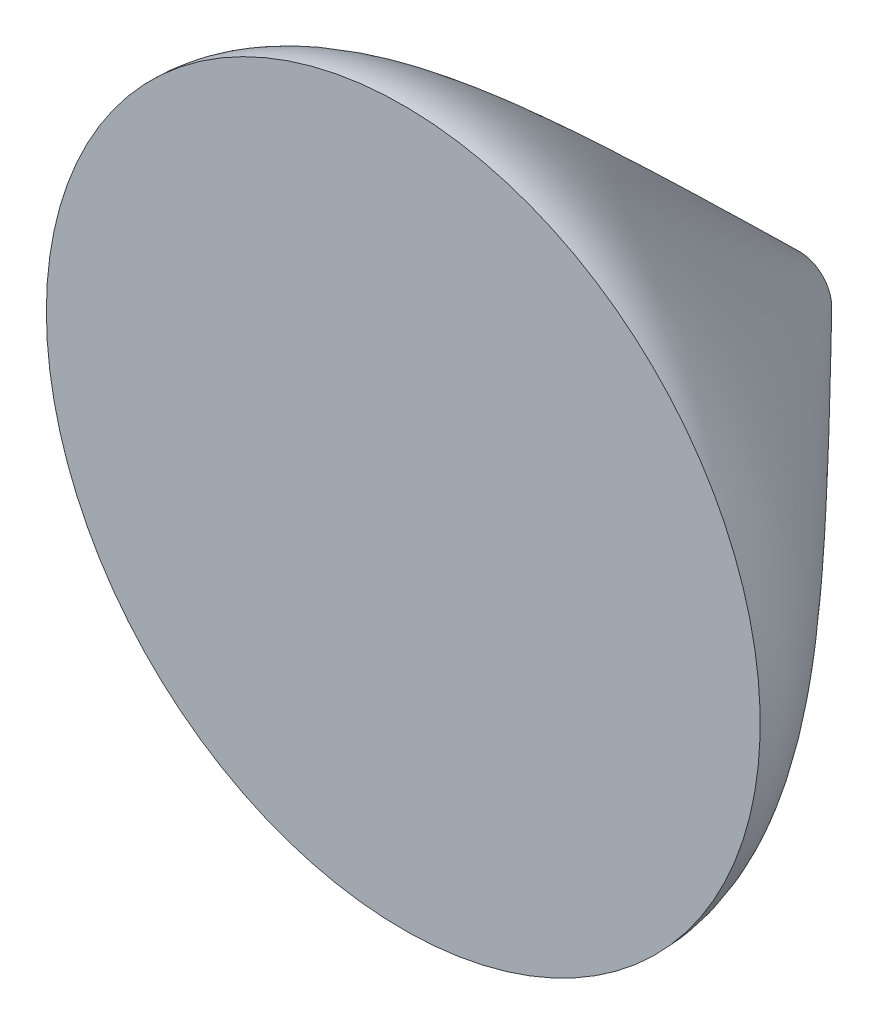
ISO-10303-21;
HEADER;
FILE_DESCRIPTION(('STEP AP214'),'2;1');
FILE_NAME('part.step','',(''),(''),'','','');
FILE_SCHEMA(('AUTOMOTIVE_DESIGN { 1 0 10303 214 1 1 1 1 }'));
ENDSEC;
DATA;
#1=APPLICATION_CONTEXT('core data for automotive mechanical design processes');
#2=APPLICATION_PROTOCOL_DEFINITION('international standard','automotive_design',2000,#1);
#3=PRODUCT_CONTEXT('',#1,'mechanical');
#4=PRODUCT('Part','Part','',(#3));
#5=PRODUCT_RELATED_PRODUCT_CATEGORY('part','',(#4));
#6=PRODUCT_DEFINITION_FORMATION('','',#4);
#7=PRODUCT_DEFINITION_CONTEXT('part definition',#1,'design');
#8=PRODUCT_DEFINITION('design','',#6,#7);
#9=PRODUCT_DEFINITION_SHAPE('','',#8);
#10=(LENGTH_UNIT() NAMED_UNIT(*) SI_UNIT(.MILLI.,.METRE.));
#11=(NAMED_UNIT(*) PLANE_ANGLE_UNIT() SI_UNIT($,.RADIAN.));
#12=(NAMED_UNIT(*) SI_UNIT($,.STERADIAN.) SOLID_ANGLE_UNIT());
#13=UNCERTAINTY_MEASURE_WITH_UNIT(LENGTH_MEASURE(1.E-05),#10,'distance_accuracy_value','');
#14=(GEOMETRIC_REPRESENTATION_CONTEXT(3) GLOBAL_UNCERTAINTY_ASSIGNED_CONTEXT((#13)) GLOBAL_UNIT_ASSIGNED_CONTEXT((#10,
#11,#12)) REPRESENTATION_CONTEXT('',''));
#15=CARTESIAN_POINT('',(0.,0.,0.));
#16=DIRECTION('',(0.,0.,1.));
#17=DIRECTION('',(1.,0.,0.));
#18=AXIS2_PLACEMENT_3D('',#15,#16,#17);
#19=CARTESIAN_POINT('',(0.,0.,-2.5));
#20=DIRECTION('',(0.,0.,-1.));
#21=DIRECTION('',(-1.,0.,0.));
#22=AXIS2_PLACEMENT_3D('',#19,#20,#21);
#23=PLANE('',#22);
#24=CARTESIAN_POINT('',(0.,0.,-2.5));
#25=DIRECTION('',(0.,0.,-1.));
#26=DIRECTION('',(-1.,0.,0.));
#27=AXIS2_PLACEMENT_3D('',#24,#25,#26);
#28=CIRCLE('',#27,0.401038559641528);
#29=CARTESIAN_POINT('',(-0.401038559641527,0.,-2.5));
#30=VERTEX_POINT('',#29);
#31=EDGE_CURVE('E43',#30,#30,#28,.T.);
#32=ORIENTED_EDGE('',*,*,#31,.T.);
#33=EDGE_LOOP('',(#32));
#34=FACE_BOUND('',#33,.T.);
#35=ADVANCED_FACE('F37',(#34),#23,.T.);
#36=CARTESIAN_POINT('',(-4.5,0.,2.5));
#37=CARTESIAN_POINT('',(-4.49999689674741,0.,2.47480821314717));
#38=CARTESIAN_POINT('',(-4.49870566069421,0.,2.43629484276351));
#39=CARTESIAN_POINT('',(-4.49418398113859,0.,2.38316985649428));
#40=CARTESIAN_POINT('',(-4.48351244737817,0.,2.31385214506502));
#41=CARTESIAN_POINT('',(-4.47047980066402,0.,2.25186619748259));
#42=CARTESIAN_POINT('',(-4.45211259730085,0.,2.18376693224887));
#43=CARTESIAN_POINT('',(-4.42706212569153,0.,2.10830651021935));
#44=CARTESIAN_POINT('',(-4.39363397702939,0.,2.02380035185704));
#45=CARTESIAN_POINT('',(-4.34812313496492,0.,1.92528159314476));
#46=CARTESIAN_POINT('',(-4.28456223577781,0.,1.80562510064391));
#47=CARTESIAN_POINT('',(-4.18991509376092,0.,1.64920107331253));
#48=CARTESIAN_POINT('',(-4.03787489186115,0.,1.42717218266865));
#49=CARTESIAN_POINT('',(-3.75403258149548,0.,1.05855665320344));
#50=CARTESIAN_POINT('',(-3.13919622096888,0.,0.345713375461749));
#51=CARTESIAN_POINT('',(-2.14563242976906,0.,-0.71048850665902));
#52=CARTESIAN_POINT('',(-0.825767364165909,0.,-2.07112983961603));
#53=CARTESIAN_POINT('',(0.757371889721605,0.,-3.67882043534611));
#54=CARTESIAN_POINT('',(2.28737995139485,0.,-5.22402582482057));
#55=CARTESIAN_POINT('',(3.43748423890276,0.,-6.38165108414622));
#56=CARTESIAN_POINT('',(4.1698573394968,0.,-7.11804846332478));
#57=CARTESIAN_POINT('',(4.49999999999696,0.,-7.44986387345005));
#58=B_SPLINE_CURVE_WITH_KNOTS('',4,(#36,#37,#38,#39,#40,#41,#42,#43,#44,#45,#46,#47,#48,#49,#50,
#51,#52,#53,#54,#55,#56,#57),.UNSPECIFIED.,.F.,.F.,(5,1,1,1,1,1,1,1,1,1,1,1,1,1,1,1,1,1,5),(0.,
0.00331697676078536,0.00507801283919514,0.00701813260874858,0.00923741065059991,
0.0116585255723541,0.0143687211555212,0.0174857952022143,0.0212135126866065,0.0259375953315512,
0.0322372892127931,0.0415237458700305,0.0567251406990137,0.0870845443527021,0.156505291987594,
0.231998057158362,0.307490833506836,0.382983610448919,0.444998285203394),.UNSPECIFIED.);
#59=CARTESIAN_POINT('',(0.,0.,-2.5));
#60=DIRECTION('',(0.,0.,-1.));
#61=AXIS1_PLACEMENT('',#59,#60);
#62=SURFACE_OF_REVOLUTION('',#58,#61);
#63=ORIENTED_EDGE('',*,*,#31,.F.);
#64=EDGE_LOOP('',(#63));
#65=FACE_BOUND('',#64,.T.);
#66=CARTESIAN_POINT('',(0.,0.,2.5));
#67=DIRECTION('',(0.,0.,-1.));
#68=DIRECTION('',(-1.,0.,0.));
#69=AXIS2_PLACEMENT_3D('',#66,#67,#68);
#70=CIRCLE('',#69,4.5);
#71=CARTESIAN_POINT('',(-4.5,0.,2.5));
#72=VERTEX_POINT('',#71);
#73=EDGE_CURVE('E10',#72,#72,#70,.T.);
#74=ORIENTED_EDGE('',*,*,#73,.T.);
#75=EDGE_LOOP('',(#74));
#76=FACE_BOUND('',#75,.T.);
#77=ADVANCED_FACE('F57',(#65,#76),#62,.T.);
#78=CARTESIAN_POINT('',(0.,0.,2.5));
#79=DIRECTION('',(0.,0.,1.));
#80=DIRECTION('',(1.,0.,0.));
#81=AXIS2_PLACEMENT_3D('',#78,#79,#80);
#82=PLANE('',#81);
#83=ORIENTED_EDGE('',*,*,#73,.F.);
#84=EDGE_LOOP('',(#83));
#85=FACE_BOUND('',#84,.T.);
#86=ADVANCED_FACE('F59',(#85),#82,.T.);
#87=CLOSED_SHELL('',(#35,#77,#86));
#88=MANIFOLD_SOLID_BREP('B2',#87);
#89=ADVANCED_BREP_SHAPE_REPRESENTATION('',(#18,#88),#14);
#90=SHAPE_DEFINITION_REPRESENTATION(#9,#89);
ENDSEC;
END-ISO-10303-21;
